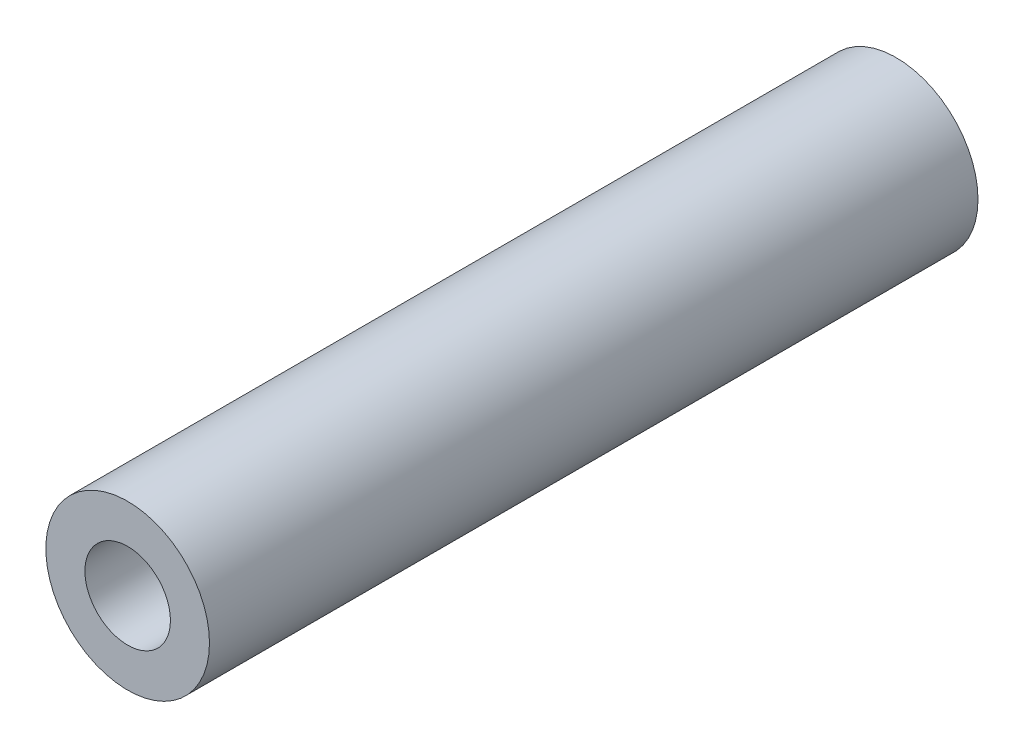
ISO-10303-21;
HEADER;
FILE_DESCRIPTION(('STEP AP214'),'2;1');
FILE_NAME('part.step','',(''),(''),'','','');
FILE_SCHEMA(('AUTOMOTIVE_DESIGN { 1 0 10303 214 1 1 1 1 }'));
ENDSEC;
DATA;
#1=APPLICATION_CONTEXT('core data for automotive mechanical design processes');
#2=APPLICATION_PROTOCOL_DEFINITION('international standard','automotive_design',2000,#1);
#3=PRODUCT_CONTEXT('',#1,'mechanical');
#4=PRODUCT('Part','Part','',(#3));
#5=PRODUCT_RELATED_PRODUCT_CATEGORY('part','',(#4));
#6=PRODUCT_DEFINITION_FORMATION('','',#4);
#7=PRODUCT_DEFINITION_CONTEXT('part definition',#1,'design');
#8=PRODUCT_DEFINITION('design','',#6,#7);
#9=PRODUCT_DEFINITION_SHAPE('','',#8);
#10=(LENGTH_UNIT() NAMED_UNIT(*) SI_UNIT(.MILLI.,.METRE.));
#11=(NAMED_UNIT(*) PLANE_ANGLE_UNIT() SI_UNIT($,.RADIAN.));
#12=(NAMED_UNIT(*) SI_UNIT($,.STERADIAN.) SOLID_ANGLE_UNIT());
#13=UNCERTAINTY_MEASURE_WITH_UNIT(LENGTH_MEASURE(1.E-05),#10,'distance_accuracy_value','');
#14=(GEOMETRIC_REPRESENTATION_CONTEXT(3) GLOBAL_UNCERTAINTY_ASSIGNED_CONTEXT((#13)) GLOBAL_UNIT_ASSIGNED_CONTEXT((#10,
#11,#12)) REPRESENTATION_CONTEXT('',''));
#15=CARTESIAN_POINT('',(0.,0.,0.));
#16=DIRECTION('',(0.,0.,1.));
#17=DIRECTION('',(1.,0.,0.));
#18=AXIS2_PLACEMENT_3D('',#15,#16,#17);
#19=CARTESIAN_POINT('',(0.,0.,22.36724));
#20=DIRECTION('',(0.,0.,1.));
#21=DIRECTION('',(1.,0.,0.));
#22=AXIS2_PLACEMENT_3D('',#19,#20,#21);
#23=PLANE('',#22);
#24=CARTESIAN_POINT('',(0.,0.,22.36724));
#25=DIRECTION('',(0.,0.,1.));
#26=DIRECTION('',(1.,0.,0.));
#27=AXIS2_PLACEMENT_3D('',#24,#25,#26);
#28=CIRCLE('',#27,4.7625);
#29=CARTESIAN_POINT('',(4.7625,0.,22.36724));
#30=VERTEX_POINT('',#29);
#31=EDGE_CURVE('E10',#30,#30,#28,.T.);
#32=ORIENTED_EDGE('',*,*,#31,.T.);
#33=EDGE_LOOP('',(#32));
#34=FACE_BOUND('',#33,.T.);
#35=CARTESIAN_POINT('',(0.,0.,22.36724));
#36=DIRECTION('',(0.,0.,1.));
#37=DIRECTION('',(1.,0.,0.));
#38=AXIS2_PLACEMENT_3D('',#35,#36,#37);
#39=CIRCLE('',#38,2.4892);
#40=CARTESIAN_POINT('',(2.4892,0.,22.36724));
#41=VERTEX_POINT('',#40);
#42=EDGE_CURVE('E56',#41,#41,#39,.T.);
#43=ORIENTED_EDGE('',*,*,#42,.F.);
#44=EDGE_LOOP('',(#43));
#45=FACE_BOUND('',#44,.T.);
#46=ADVANCED_FACE('F43',(#34,#45),#23,.T.);
#47=CARTESIAN_POINT('',(0.,0.,-22.36724));
#48=DIRECTION('',(0.,0.,1.));
#49=DIRECTION('',(1.,0.,0.));
#50=AXIS2_PLACEMENT_3D('',#47,#48,#49);
#51=PLANE('',#50);
#52=CARTESIAN_POINT('',(0.,0.,-22.36724));
#53=DIRECTION('',(0.,0.,1.));
#54=DIRECTION('',(1.,0.,0.));
#55=AXIS2_PLACEMENT_3D('',#52,#53,#54);
#56=CIRCLE('',#55,4.7625);
#57=CARTESIAN_POINT('',(4.7625,0.,-22.36724));
#58=VERTEX_POINT('',#57);
#59=EDGE_CURVE('E47',#58,#58,#56,.T.);
#60=ORIENTED_EDGE('',*,*,#59,.F.);
#61=EDGE_LOOP('',(#60));
#62=FACE_BOUND('',#61,.T.);
#63=CARTESIAN_POINT('',(0.,0.,-22.36724));
#64=DIRECTION('',(0.,0.,1.));
#65=DIRECTION('',(1.,0.,0.));
#66=AXIS2_PLACEMENT_3D('',#63,#64,#65);
#67=CIRCLE('',#66,2.4892);
#68=CARTESIAN_POINT('',(2.4892,0.,-22.36724));
#69=VERTEX_POINT('',#68);
#70=EDGE_CURVE('E58',#69,#69,#67,.T.);
#71=ORIENTED_EDGE('',*,*,#70,.T.);
#72=EDGE_LOOP('',(#71));
#73=FACE_BOUND('',#72,.T.);
#74=ADVANCED_FACE('F70',(#62,#73),#51,.F.);
#75=CARTESIAN_POINT('',(0.,0.,22.36724));
#76=DIRECTION('',(0.,0.,-1.));
#77=DIRECTION('',(-1.,0.,0.));
#78=AXIS2_PLACEMENT_3D('',#75,#76,#77);
#79=CYLINDRICAL_SURFACE('',#78,4.7625);
#80=ORIENTED_EDGE('',*,*,#31,.F.);
#81=EDGE_LOOP('',(#80));
#82=FACE_BOUND('',#81,.T.);
#83=ORIENTED_EDGE('',*,*,#59,.T.);
#84=EDGE_LOOP('',(#83));
#85=FACE_BOUND('',#84,.T.);
#86=ADVANCED_FACE('F45',(#82,#85),#79,.T.);
#87=CARTESIAN_POINT('',(0.,0.,22.36724));
#88=DIRECTION('',(0.,0.,-1.));
#89=DIRECTION('',(-1.,0.,0.));
#90=AXIS2_PLACEMENT_3D('',#87,#88,#89);
#91=CYLINDRICAL_SURFACE('',#90,2.4892);
#92=ORIENTED_EDGE('',*,*,#42,.T.);
#93=EDGE_LOOP('',(#92));
#94=FACE_BOUND('',#93,.T.);
#95=ORIENTED_EDGE('',*,*,#70,.F.);
#96=EDGE_LOOP('',(#95));
#97=FACE_BOUND('',#96,.T.);
#98=ADVANCED_FACE('F66',(#94,#97),#91,.F.);
#99=CLOSED_SHELL('',(#46,#74,#86,#98));
#100=MANIFOLD_SOLID_BREP('B2',#99);
#101=ADVANCED_BREP_SHAPE_REPRESENTATION('',(#18,#100),#14);
#102=SHAPE_DEFINITION_REPRESENTATION(#9,#101);
ENDSEC;
END-ISO-10303-21;
